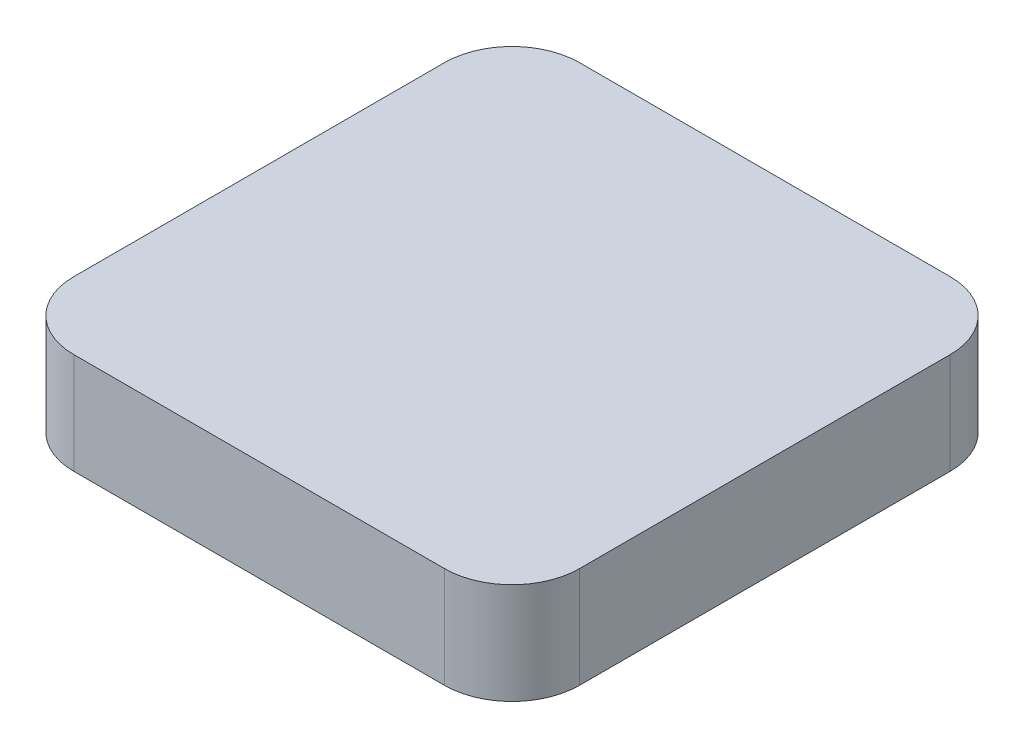
ISO-10303-21;
HEADER;
FILE_DESCRIPTION(('STEP AP214'),'2;1');
FILE_NAME('part.step','',(''),(''),'','','');
FILE_SCHEMA(('AUTOMOTIVE_DESIGN { 1 0 10303 214 1 1 1 1 }'));
ENDSEC;
DATA;
#1=APPLICATION_CONTEXT('core data for automotive mechanical design processes');
#2=APPLICATION_PROTOCOL_DEFINITION('international standard','automotive_design',2000,#1);
#3=PRODUCT_CONTEXT('',#1,'mechanical');
#4=PRODUCT('Part','Part','',(#3));
#5=PRODUCT_RELATED_PRODUCT_CATEGORY('part','',(#4));
#6=PRODUCT_DEFINITION_FORMATION('','',#4);
#7=PRODUCT_DEFINITION_CONTEXT('part definition',#1,'design');
#8=PRODUCT_DEFINITION('design','',#6,#7);
#9=PRODUCT_DEFINITION_SHAPE('','',#8);
#10=(LENGTH_UNIT() NAMED_UNIT(*) SI_UNIT(.MILLI.,.METRE.));
#11=(NAMED_UNIT(*) PLANE_ANGLE_UNIT() SI_UNIT($,.RADIAN.));
#12=(NAMED_UNIT(*) SI_UNIT($,.STERADIAN.) SOLID_ANGLE_UNIT());
#13=UNCERTAINTY_MEASURE_WITH_UNIT(LENGTH_MEASURE(1.E-05),#10,'distance_accuracy_value','');
#14=(GEOMETRIC_REPRESENTATION_CONTEXT(3) GLOBAL_UNCERTAINTY_ASSIGNED_CONTEXT((#13)) GLOBAL_UNIT_ASSIGNED_CONTEXT((#10,
#11,#12)) REPRESENTATION_CONTEXT('',''));
#15=CARTESIAN_POINT('',(0.,0.,0.));
#16=DIRECTION('',(0.,0.,1.));
#17=DIRECTION('',(1.,0.,0.));
#18=AXIS2_PLACEMENT_3D('',#15,#16,#17);
#19=CARTESIAN_POINT('',(201.892884643449,119.171674245952,148.819588846238));
#20=DIRECTION('',(1.,0.,0.));
#21=DIRECTION('',(0.,-1.,0.));
#22=AXIS2_PLACEMENT_3D('',#19,#20,#21);
#23=PLANE('',#22);
#24=DIRECTION('',(0.,0.,1.));
#25=VECTOR('',#24,1.);
#26=CARTESIAN_POINT('',(201.892884643449,116.171674245952,148.819588846238));
#27=LINE('',#26,#25);
#28=CARTESIAN_POINT('',(201.892884643449,116.171674245952,143.319588846238));
#29=VERTEX_POINT('',#28);
#30=CARTESIAN_POINT('',(201.892884643449,116.171674245952,154.319588846238));
#31=VERTEX_POINT('',#30);
#32=EDGE_CURVE('E139',#29,#31,#27,.T.);
#33=ORIENTED_EDGE('',*,*,#32,.T.);
#34=DIRECTION('',(0.,-1.,0.));
#35=VECTOR('',#34,1.);
#36=CARTESIAN_POINT('',(201.892884643449,119.171674245952,154.319588846238));
#37=LINE('',#36,#35);
#38=CARTESIAN_POINT('',(201.892884643449,119.171674245952,154.319588846238));
#39=VERTEX_POINT('',#38);
#40=EDGE_CURVE('E48',#39,#31,#37,.T.);
#41=ORIENTED_EDGE('',*,*,#40,.F.);
#42=DIRECTION('',(0.,0.,1.));
#43=VECTOR('',#42,1.);
#44=CARTESIAN_POINT('',(201.892884643449,119.171674245952,143.319588846238));
#45=LINE('',#44,#43);
#46=CARTESIAN_POINT('',(201.892884643449,119.171674245952,143.319588846238));
#47=VERTEX_POINT('',#46);
#48=EDGE_CURVE('E99',#47,#39,#45,.T.);
#49=ORIENTED_EDGE('',*,*,#48,.F.);
#50=DIRECTION('',(0.,-1.,0.));
#51=VECTOR('',#50,1.);
#52=CARTESIAN_POINT('',(201.892884643449,119.171674245952,143.319588846238));
#53=LINE('',#52,#51);
#54=EDGE_CURVE('E11',#47,#29,#53,.T.);
#55=ORIENTED_EDGE('',*,*,#54,.T.);
#56=EDGE_LOOP('',(#33,#41,#49,#55));
#57=FACE_BOUND('',#56,.T.);
#58=ADVANCED_FACE('F40',(#57),#23,.F.);
#59=CARTESIAN_POINT('',(203.892884643449,119.171674245952,154.319588846238));
#60=DIRECTION('',(0.,-1.,0.));
#61=DIRECTION('',(0.,0.,-1.));
#62=AXIS2_PLACEMENT_3D('',#59,#60,#61);
#63=CYLINDRICAL_SURFACE('',#62,2.);
#64=CARTESIAN_POINT('',(203.892884643449,116.171674245952,154.319588846238));
#65=DIRECTION('',(0.,1.,0.));
#66=DIRECTION('',(0.,0.,1.));
#67=AXIS2_PLACEMENT_3D('',#64,#65,#66);
#68=CIRCLE('',#67,2.);
#69=CARTESIAN_POINT('',(203.892884643449,116.171674245952,156.319588846238));
#70=VERTEX_POINT('',#69);
#71=EDGE_CURVE('E142',#31,#70,#68,.T.);
#72=ORIENTED_EDGE('',*,*,#71,.T.);
#73=DIRECTION('',(0.,-1.,0.));
#74=VECTOR('',#73,1.);
#75=CARTESIAN_POINT('',(203.892884643449,119.171674245952,156.319588846238));
#76=LINE('',#75,#74);
#77=CARTESIAN_POINT('',(203.892884643449,119.171674245952,156.319588846238));
#78=VERTEX_POINT('',#77);
#79=EDGE_CURVE('E162',#78,#70,#76,.T.);
#80=ORIENTED_EDGE('',*,*,#79,.F.);
#81=CARTESIAN_POINT('',(203.892884643449,119.171674245952,154.319588846238));
#82=DIRECTION('',(0.,1.,0.));
#83=DIRECTION('',(0.,0.,1.));
#84=AXIS2_PLACEMENT_3D('',#81,#82,#83);
#85=CIRCLE('',#84,2.);
#86=EDGE_CURVE('E169',#39,#78,#85,.T.);
#87=ORIENTED_EDGE('',*,*,#86,.F.);
#88=ORIENTED_EDGE('',*,*,#40,.T.);
#89=EDGE_LOOP('',(#72,#80,#87,#88));
#90=FACE_BOUND('',#89,.T.);
#91=ADVANCED_FACE('F167',(#90),#63,.T.);
#92=CARTESIAN_POINT('',(203.892884643449,119.171674245952,156.319588846238));
#93=DIRECTION('',(0.,0.,-1.));
#94=DIRECTION('',(0.,1.,0.));
#95=AXIS2_PLACEMENT_3D('',#92,#93,#94);
#96=PLANE('',#95);
#97=DIRECTION('',(1.,0.,0.));
#98=VECTOR('',#97,1.);
#99=CARTESIAN_POINT('',(203.892884643449,116.171674245952,156.319588846238));
#100=LINE('',#99,#98);
#101=CARTESIAN_POINT('',(214.892884643449,116.171674245952,156.319588846238));
#102=VERTEX_POINT('',#101);
#103=EDGE_CURVE('E144',#70,#102,#100,.T.);
#104=ORIENTED_EDGE('',*,*,#103,.T.);
#105=DIRECTION('',(0.,-1.,0.));
#106=VECTOR('',#105,1.);
#107=CARTESIAN_POINT('',(214.892884643449,119.171674245952,156.319588846238));
#108=LINE('',#107,#106);
#109=CARTESIAN_POINT('',(214.892884643449,119.171674245952,156.319588846238));
#110=VERTEX_POINT('',#109);
#111=EDGE_CURVE('E159',#110,#102,#108,.T.);
#112=ORIENTED_EDGE('',*,*,#111,.F.);
#113=DIRECTION('',(1.,0.,0.));
#114=VECTOR('',#113,1.);
#115=CARTESIAN_POINT('',(203.892884643449,119.171674245952,156.319588846238));
#116=LINE('',#115,#114);
#117=EDGE_CURVE('E180',#78,#110,#116,.T.);
#118=ORIENTED_EDGE('',*,*,#117,.F.);
#119=ORIENTED_EDGE('',*,*,#79,.T.);
#120=EDGE_LOOP('',(#104,#112,#118,#119));
#121=FACE_BOUND('',#120,.T.);
#122=ADVANCED_FACE('F184',(#121),#96,.F.);
#123=CARTESIAN_POINT('',(214.892884643449,119.171674245952,154.319588846238));
#124=DIRECTION('',(0.,-1.,0.));
#125=DIRECTION('',(0.,0.,-1.));
#126=AXIS2_PLACEMENT_3D('',#123,#124,#125);
#127=CYLINDRICAL_SURFACE('',#126,2.);
#128=CARTESIAN_POINT('',(214.892884643449,116.171674245952,154.319588846238));
#129=DIRECTION('',(0.,1.,0.));
#130=DIRECTION('',(0.,0.,1.));
#131=AXIS2_PLACEMENT_3D('',#128,#129,#130);
#132=CIRCLE('',#131,2.);
#133=CARTESIAN_POINT('',(216.892884643449,116.171674245952,154.319588846238));
#134=VERTEX_POINT('',#133);
#135=EDGE_CURVE('E147',#102,#134,#132,.T.);
#136=ORIENTED_EDGE('',*,*,#135,.T.);
#137=DIRECTION('',(0.,-1.,0.));
#138=VECTOR('',#137,1.);
#139=CARTESIAN_POINT('',(216.892884643449,119.171674245952,154.319588846238));
#140=LINE('',#139,#138);
#141=CARTESIAN_POINT('',(216.892884643449,119.171674245952,154.319588846238));
#142=VERTEX_POINT('',#141);
#143=EDGE_CURVE('E128',#142,#134,#140,.T.);
#144=ORIENTED_EDGE('',*,*,#143,.F.);
#145=CARTESIAN_POINT('',(214.892884643449,119.171674245952,154.319588846238));
#146=DIRECTION('',(0.,1.,0.));
#147=DIRECTION('',(0.,0.,1.));
#148=AXIS2_PLACEMENT_3D('',#145,#146,#147);
#149=CIRCLE('',#148,2.);
#150=EDGE_CURVE('E119',#110,#142,#149,.T.);
#151=ORIENTED_EDGE('',*,*,#150,.F.);
#152=ORIENTED_EDGE('',*,*,#111,.T.);
#153=EDGE_LOOP('',(#136,#144,#151,#152));
#154=FACE_BOUND('',#153,.T.);
#155=ADVANCED_FACE('F186',(#154),#127,.T.);
#156=CARTESIAN_POINT('',(216.892884643449,119.171674245952,148.819588846238));
#157=DIRECTION('',(-1.,0.,0.));
#158=DIRECTION('',(0.,1.,0.));
#159=AXIS2_PLACEMENT_3D('',#156,#157,#158);
#160=PLANE('',#159);
#161=DIRECTION('',(0.,0.,-1.));
#162=VECTOR('',#161,1.);
#163=CARTESIAN_POINT('',(216.892884643449,116.171674245952,148.819588846238));
#164=LINE('',#163,#162);
#165=CARTESIAN_POINT('',(216.892884643449,116.171674245952,143.319588846238));
#166=VERTEX_POINT('',#165);
#167=EDGE_CURVE('E127',#134,#166,#164,.T.);
#168=ORIENTED_EDGE('',*,*,#167,.T.);
#169=DIRECTION('',(0.,-1.,0.));
#170=VECTOR('',#169,1.);
#171=CARTESIAN_POINT('',(216.892884643449,119.171674245952,143.319588846238));
#172=LINE('',#171,#170);
#173=CARTESIAN_POINT('',(216.892884643449,119.171674245952,143.319588846238));
#174=VERTEX_POINT('',#173);
#175=EDGE_CURVE('E125',#174,#166,#172,.T.);
#176=ORIENTED_EDGE('',*,*,#175,.F.);
#177=DIRECTION('',(0.,0.,-1.));
#178=VECTOR('',#177,1.);
#179=CARTESIAN_POINT('',(216.892884643449,119.171674245952,154.319588846238));
#180=LINE('',#179,#178);
#181=EDGE_CURVE('E113',#142,#174,#180,.T.);
#182=ORIENTED_EDGE('',*,*,#181,.F.);
#183=ORIENTED_EDGE('',*,*,#143,.T.);
#184=EDGE_LOOP('',(#168,#176,#182,#183));
#185=FACE_BOUND('',#184,.T.);
#186=ADVANCED_FACE('F126',(#185),#160,.F.);
#187=CARTESIAN_POINT('',(214.892884643449,119.171674245952,143.319588846238));
#188=DIRECTION('',(0.,-1.,0.));
#189=DIRECTION('',(0.,0.,-1.));
#190=AXIS2_PLACEMENT_3D('',#187,#188,#189);
#191=CYLINDRICAL_SURFACE('',#190,2.);
#192=CARTESIAN_POINT('',(214.892884643449,116.171674245952,143.319588846238));
#193=DIRECTION('',(0.,1.,0.));
#194=DIRECTION('',(0.,0.,1.));
#195=AXIS2_PLACEMENT_3D('',#192,#193,#194);
#196=CIRCLE('',#195,2.);
#197=CARTESIAN_POINT('',(214.892884643449,116.171674245952,141.319588846238));
#198=VERTEX_POINT('',#197);
#199=EDGE_CURVE('E85',#166,#198,#196,.T.);
#200=ORIENTED_EDGE('',*,*,#199,.T.);
#201=DIRECTION('',(0.,-1.,0.));
#202=VECTOR('',#201,1.);
#203=CARTESIAN_POINT('',(214.892884643449,119.171674245952,141.319588846238));
#204=LINE('',#203,#202);
#205=CARTESIAN_POINT('',(214.892884643449,119.171674245952,141.319588846238));
#206=VERTEX_POINT('',#205);
#207=EDGE_CURVE('E129',#206,#198,#204,.T.);
#208=ORIENTED_EDGE('',*,*,#207,.F.);
#209=CARTESIAN_POINT('',(214.892884643449,119.171674245952,143.319588846238));
#210=DIRECTION('',(0.,1.,0.));
#211=DIRECTION('',(0.,0.,1.));
#212=AXIS2_PLACEMENT_3D('',#209,#210,#211);
#213=CIRCLE('',#212,2.);
#214=EDGE_CURVE('E117',#174,#206,#213,.T.);
#215=ORIENTED_EDGE('',*,*,#214,.F.);
#216=ORIENTED_EDGE('',*,*,#175,.T.);
#217=EDGE_LOOP('',(#200,#208,#215,#216));
#218=FACE_BOUND('',#217,.T.);
#219=ADVANCED_FACE('F131',(#218),#191,.T.);
#220=CARTESIAN_POINT('',(214.892884643449,119.171674245952,141.319588846238));
#221=DIRECTION('',(0.,0.,1.));
#222=DIRECTION('',(0.,-1.,0.));
#223=AXIS2_PLACEMENT_3D('',#220,#221,#222);
#224=PLANE('',#223);
#225=DIRECTION('',(-1.,0.,0.));
#226=VECTOR('',#225,1.);
#227=CARTESIAN_POINT('',(214.892884643449,116.171674245952,141.319588846238));
#228=LINE('',#227,#226);
#229=CARTESIAN_POINT('',(203.892884643449,116.171674245952,141.319588846238));
#230=VERTEX_POINT('',#229);
#231=EDGE_CURVE('E92',#198,#230,#228,.T.);
#232=ORIENTED_EDGE('',*,*,#231,.T.);
#233=DIRECTION('',(0.,-1.,0.));
#234=VECTOR('',#233,1.);
#235=CARTESIAN_POINT('',(203.892884643449,119.171674245952,141.319588846238));
#236=LINE('',#235,#234);
#237=CARTESIAN_POINT('',(203.892884643449,119.171674245952,141.319588846238));
#238=VERTEX_POINT('',#237);
#239=EDGE_CURVE('E135',#238,#230,#236,.T.);
#240=ORIENTED_EDGE('',*,*,#239,.F.);
#241=DIRECTION('',(-1.,0.,0.));
#242=VECTOR('',#241,1.);
#243=CARTESIAN_POINT('',(214.892884643449,119.171674245952,141.319588846238));
#244=LINE('',#243,#242);
#245=EDGE_CURVE('E133',#206,#238,#244,.T.);
#246=ORIENTED_EDGE('',*,*,#245,.F.);
#247=ORIENTED_EDGE('',*,*,#207,.T.);
#248=EDGE_LOOP('',(#232,#240,#246,#247));
#249=FACE_BOUND('',#248,.T.);
#250=ADVANCED_FACE('F175',(#249),#224,.F.);
#251=CARTESIAN_POINT('',(203.892884643449,119.171674245952,143.319588846238));
#252=DIRECTION('',(0.,-1.,0.));
#253=DIRECTION('',(0.,0.,-1.));
#254=AXIS2_PLACEMENT_3D('',#251,#252,#253);
#255=CYLINDRICAL_SURFACE('',#254,2.);
#256=CARTESIAN_POINT('',(203.892884643449,116.171674245952,143.319588846238));
#257=DIRECTION('',(0.,1.,0.));
#258=DIRECTION('',(0.,0.,1.));
#259=AXIS2_PLACEMENT_3D('',#256,#257,#258);
#260=CIRCLE('',#259,2.);
#261=EDGE_CURVE('E153',#230,#29,#260,.T.);
#262=ORIENTED_EDGE('',*,*,#261,.T.);
#263=ORIENTED_EDGE('',*,*,#54,.F.);
#264=CARTESIAN_POINT('',(203.892884643449,119.171674245952,143.319588846238));
#265=DIRECTION('',(0.,1.,0.));
#266=DIRECTION('',(0.,0.,1.));
#267=AXIS2_PLACEMENT_3D('',#264,#265,#266);
#268=CIRCLE('',#267,2.);
#269=EDGE_CURVE('E56',#238,#47,#268,.T.);
#270=ORIENTED_EDGE('',*,*,#269,.F.);
#271=ORIENTED_EDGE('',*,*,#239,.T.);
#272=EDGE_LOOP('',(#262,#263,#270,#271));
#273=FACE_BOUND('',#272,.T.);
#274=ADVANCED_FACE('F174',(#273),#255,.T.);
#275=CARTESIAN_POINT('',(203.892884643449,119.171674245952,143.319588846238));
#276=DIRECTION('',(0.,1.,0.));
#277=DIRECTION('',(0.,0.,1.));
#278=AXIS2_PLACEMENT_3D('',#275,#276,#277);
#279=PLANE('',#278);
#280=ORIENTED_EDGE('',*,*,#269,.T.);
#281=ORIENTED_EDGE('',*,*,#48,.T.);
#282=ORIENTED_EDGE('',*,*,#86,.T.);
#283=ORIENTED_EDGE('',*,*,#117,.T.);
#284=ORIENTED_EDGE('',*,*,#150,.T.);
#285=ORIENTED_EDGE('',*,*,#181,.T.);
#286=ORIENTED_EDGE('',*,*,#214,.T.);
#287=ORIENTED_EDGE('',*,*,#245,.T.);
#288=EDGE_LOOP('',(#280,#281,#282,#283,#284,#285,#286,#287));
#289=FACE_BOUND('',#288,.T.);
#290=ADVANCED_FACE('F115',(#289),#279,.T.);
#291=CARTESIAN_POINT('',(203.892884643449,116.171674245952,143.319588846238));
#292=DIRECTION('',(0.,1.,0.));
#293=DIRECTION('',(0.,0.,1.));
#294=AXIS2_PLACEMENT_3D('',#291,#292,#293);
#295=PLANE('',#294);
#296=ORIENTED_EDGE('',*,*,#32,.F.);
#297=ORIENTED_EDGE('',*,*,#261,.F.);
#298=ORIENTED_EDGE('',*,*,#231,.F.);
#299=ORIENTED_EDGE('',*,*,#199,.F.);
#300=ORIENTED_EDGE('',*,*,#167,.F.);
#301=ORIENTED_EDGE('',*,*,#135,.F.);
#302=ORIENTED_EDGE('',*,*,#103,.F.);
#303=ORIENTED_EDGE('',*,*,#71,.F.);
#304=EDGE_LOOP('',(#296,#297,#298,#299,#300,#301,#302,#303));
#305=FACE_BOUND('',#304,.T.);
#306=ADVANCED_FACE('F172',(#305),#295,.F.);
#307=CLOSED_SHELL('',(#58,#91,#122,#155,#186,#219,#250,#274,#290,#306));
#308=MANIFOLD_SOLID_BREP('B2',#307);
#309=ADVANCED_BREP_SHAPE_REPRESENTATION('',(#18,#308),#14);
#310=SHAPE_DEFINITION_REPRESENTATION(#9,#309);
ENDSEC;
END-ISO-10303-21;
